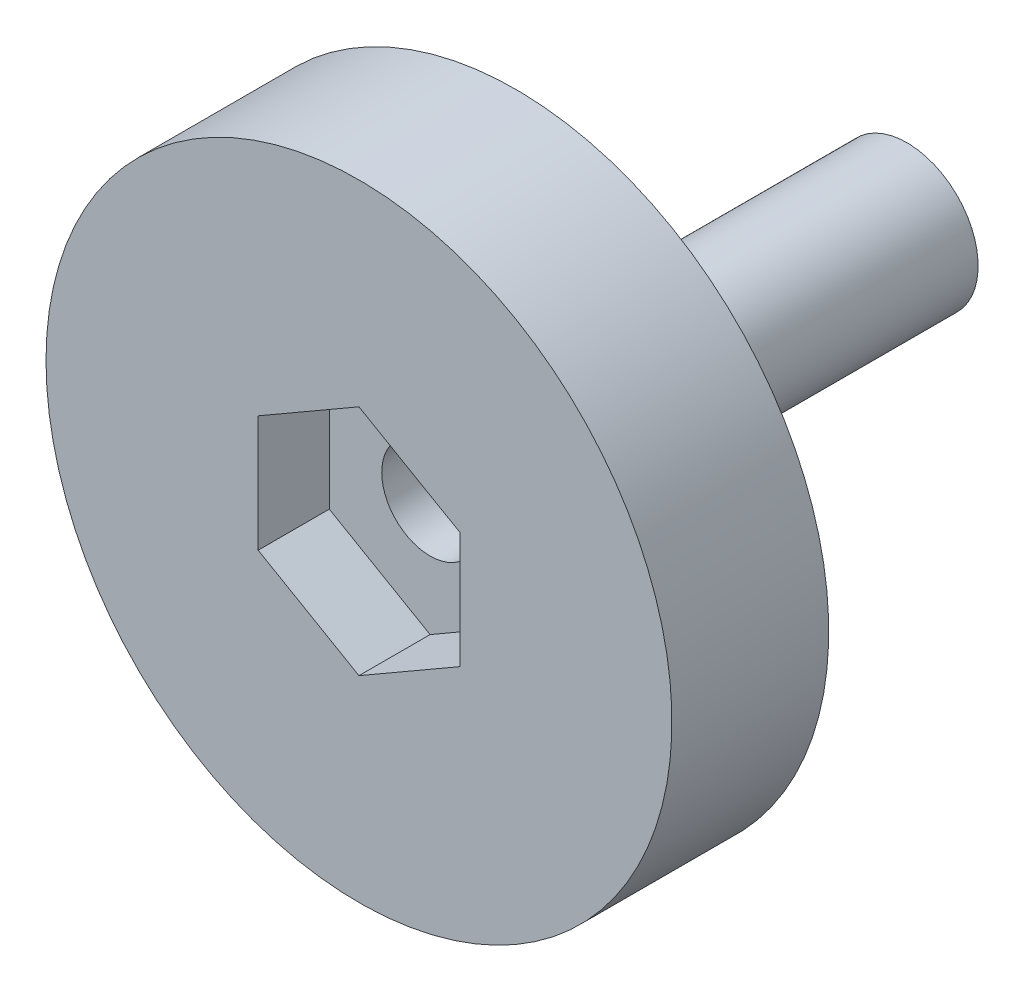
ISO-10303-21;
HEADER;
FILE_DESCRIPTION(('STEP AP214'),'2;1');
FILE_NAME('part.step','',(''),(''),'','','');
FILE_SCHEMA(('AUTOMOTIVE_DESIGN { 1 0 10303 214 1 1 1 1 }'));
ENDSEC;
DATA;
#1=APPLICATION_CONTEXT('core data for automotive mechanical design processes');
#2=APPLICATION_PROTOCOL_DEFINITION('international standard','automotive_design',2000,#1);
#3=PRODUCT_CONTEXT('',#1,'mechanical');
#4=PRODUCT('Part','Part','',(#3));
#5=PRODUCT_RELATED_PRODUCT_CATEGORY('part','',(#4));
#6=PRODUCT_DEFINITION_FORMATION('','',#4);
#7=PRODUCT_DEFINITION_CONTEXT('part definition',#1,'design');
#8=PRODUCT_DEFINITION('design','',#6,#7);
#9=PRODUCT_DEFINITION_SHAPE('','',#8);
#10=(LENGTH_UNIT() NAMED_UNIT(*) SI_UNIT(.MILLI.,.METRE.));
#11=(NAMED_UNIT(*) PLANE_ANGLE_UNIT() SI_UNIT($,.RADIAN.));
#12=(NAMED_UNIT(*) SI_UNIT($,.STERADIAN.) SOLID_ANGLE_UNIT());
#13=UNCERTAINTY_MEASURE_WITH_UNIT(LENGTH_MEASURE(1.E-05),#10,'distance_accuracy_value','');
#14=(GEOMETRIC_REPRESENTATION_CONTEXT(3) GLOBAL_UNCERTAINTY_ASSIGNED_CONTEXT((#13)) GLOBAL_UNIT_ASSIGNED_CONTEXT((#10,
#11,#12)) REPRESENTATION_CONTEXT('',''));
#15=CARTESIAN_POINT('',(0.,0.,0.));
#16=DIRECTION('',(0.,0.,1.));
#17=DIRECTION('',(1.,0.,0.));
#18=AXIS2_PLACEMENT_3D('',#15,#16,#17);
#19=CARTESIAN_POINT('',(-12.7762674554111,0.,-12.7000000000382));
#20=DIRECTION('',(0.,0.,-1.));
#21=DIRECTION('',(-1.,0.,0.));
#22=AXIS2_PLACEMENT_3D('',#19,#20,#21);
#23=CYLINDRICAL_SURFACE('',#22,2.15899999999996);
#24=CARTESIAN_POINT('',(-12.7762674554111,0.,-12.7000000000381));
#25=DIRECTION('',(0.,0.,-1.));
#26=DIRECTION('',(-1.,0.,0.));
#27=AXIS2_PLACEMENT_3D('',#24,#25,#26);
#28=CIRCLE('',#27,2.159);
#29=CARTESIAN_POINT('',(-14.9352674554111,0.,-12.7000000000381));
#30=VERTEX_POINT('',#29);
#31=EDGE_CURVE('E152',#30,#30,#28,.T.);
#32=ORIENTED_EDGE('',*,*,#31,.T.);
#33=EDGE_LOOP('',(#32));
#34=FACE_BOUND('',#33,.T.);
#35=CARTESIAN_POINT('',(-12.776267455411,0.,8.58749999999998));
#36=DIRECTION('',(0.,0.,1.));
#37=DIRECTION('',(1.,0.,0.));
#38=AXIS2_PLACEMENT_3D('',#35,#36,#37);
#39=CIRCLE('',#38,2.15899999999996);
#40=CARTESIAN_POINT('',(-10.6172674554111,0.,8.58749999999998));
#41=VERTEX_POINT('',#40);
#42=EDGE_CURVE('E42',#41,#41,#39,.F.);
#43=ORIENTED_EDGE('',*,*,#42,.F.);
#44=EDGE_LOOP('',(#43));
#45=FACE_BOUND('',#44,.T.);
#46=ADVANCED_FACE('F39',(#34,#45),#23,.F.);
#47=CARTESIAN_POINT('',(-10.6172674554111,0.,11.7625));
#48=DIRECTION('',(0.,0.,-1.));
#49=DIRECTION('',(-1.,0.,0.));
#50=AXIS2_PLACEMENT_3D('',#47,#48,#49);
#51=PLANE('',#50);
#52=DIRECTION('',(0.866025403784439,0.5,0.));
#53=VECTOR('',#52,1.);
#54=CARTESIAN_POINT('',(-12.776267455411,-5.19615242270663,11.7625));
#55=LINE('',#54,#53);
#56=CARTESIAN_POINT('',(-12.776267455411,-5.19615242270663,11.7625));
#57=VERTEX_POINT('',#56);
#58=CARTESIAN_POINT('',(-8.27626745541104,-2.59807621135332,11.7625));
#59=VERTEX_POINT('',#58);
#60=EDGE_CURVE('E134',#57,#59,#55,.T.);
#61=ORIENTED_EDGE('',*,*,#60,.F.);
#62=DIRECTION('',(0.866025403784439,-0.5,0.));
#63=VECTOR('',#62,1.);
#64=CARTESIAN_POINT('',(-17.276267455411,-2.59807621135332,11.7625));
#65=LINE('',#64,#63);
#66=CARTESIAN_POINT('',(-17.276267455411,-2.59807621135332,11.7625));
#67=VERTEX_POINT('',#66);
#68=EDGE_CURVE('E55',#67,#57,#65,.T.);
#69=ORIENTED_EDGE('',*,*,#68,.F.);
#70=DIRECTION('',(0.,-1.,0.));
#71=VECTOR('',#70,1.);
#72=CARTESIAN_POINT('',(-17.276267455411,2.59807621135332,11.7625));
#73=LINE('',#72,#71);
#74=CARTESIAN_POINT('',(-17.276267455411,2.59807621135332,11.7625));
#75=VERTEX_POINT('',#74);
#76=EDGE_CURVE('E143',#75,#67,#73,.T.);
#77=ORIENTED_EDGE('',*,*,#76,.F.);
#78=DIRECTION('',(-0.866025403784439,-0.5,0.));
#79=VECTOR('',#78,1.);
#80=CARTESIAN_POINT('',(-12.776267455411,5.19615242270663,11.7625));
#81=LINE('',#80,#79);
#82=CARTESIAN_POINT('',(-12.776267455411,5.19615242270663,11.7625));
#83=VERTEX_POINT('',#82);
#84=EDGE_CURVE('E141',#83,#75,#81,.T.);
#85=ORIENTED_EDGE('',*,*,#84,.F.);
#86=DIRECTION('',(-0.866025403784439,0.5,0.));
#87=VECTOR('',#86,1.);
#88=CARTESIAN_POINT('',(-8.27626745541104,2.59807621135331,11.7625));
#89=LINE('',#88,#87);
#90=CARTESIAN_POINT('',(-8.27626745541104,2.59807621135331,11.7625));
#91=VERTEX_POINT('',#90);
#92=EDGE_CURVE('E104',#91,#83,#89,.T.);
#93=ORIENTED_EDGE('',*,*,#92,.F.);
#94=DIRECTION('',(0.,1.,0.));
#95=VECTOR('',#94,1.);
#96=CARTESIAN_POINT('',(-8.27626745541104,-2.59807621135332,11.7625));
#97=LINE('',#96,#95);
#98=EDGE_CURVE('E137',#59,#91,#97,.T.);
#99=ORIENTED_EDGE('',*,*,#98,.F.);
#100=EDGE_LOOP('',(#61,#69,#77,#85,#93,#99));
#101=FACE_BOUND('',#100,.T.);
#102=CARTESIAN_POINT('',(-12.776267455411,0.,11.7625));
#103=DIRECTION('',(0.,0.,-1.));
#104=DIRECTION('',(-1.,0.,0.));
#105=AXIS2_PLACEMENT_3D('',#102,#103,#104);
#106=CIRCLE('',#105,13.9699999999999);
#107=CARTESIAN_POINT('',(-26.7462674554109,0.,11.7625000000001));
#108=VERTEX_POINT('',#107);
#109=EDGE_CURVE('E11',#108,#108,#106,.T.);
#110=ORIENTED_EDGE('',*,*,#109,.F.);
#111=EDGE_LOOP('',(#110));
#112=FACE_BOUND('',#111,.T.);
#113=ADVANCED_FACE('F179',(#101,#112),#51,.F.);
#114=CARTESIAN_POINT('',(-12.7762674554111,0.,-12.7000000000382));
#115=DIRECTION('',(0.,0.,-1.));
#116=DIRECTION('',(-1.,0.,0.));
#117=AXIS2_PLACEMENT_3D('',#114,#115,#116);
#118=CYLINDRICAL_SURFACE('',#117,13.9699999999999);
#119=CARTESIAN_POINT('',(-12.776267455411,0.,4.76250000000004));
#120=DIRECTION('',(0.,0.,-1.));
#121=DIRECTION('',(-1.,0.,0.));
#122=AXIS2_PLACEMENT_3D('',#119,#120,#121);
#123=CIRCLE('',#122,13.9699999999999);
#124=CARTESIAN_POINT('',(-26.746267455411,0.,4.76250000000009));
#125=VERTEX_POINT('',#124);
#126=EDGE_CURVE('E48',#125,#125,#123,.T.);
#127=ORIENTED_EDGE('',*,*,#126,.F.);
#128=EDGE_LOOP('',(#127));
#129=FACE_BOUND('',#128,.T.);
#130=ORIENTED_EDGE('',*,*,#109,.T.);
#131=EDGE_LOOP('',(#130));
#132=FACE_BOUND('',#131,.T.);
#133=ADVANCED_FACE('F176',(#129,#132),#118,.T.);
#134=CARTESIAN_POINT('',(-6.42626745541109,0.,4.76250000000001));
#135=DIRECTION('',(0.,0.,1.));
#136=DIRECTION('',(1.,0.,0.));
#137=AXIS2_PLACEMENT_3D('',#134,#135,#136);
#138=PLANE('',#137);
#139=CARTESIAN_POINT('',(-12.776267455411,0.,4.76250000000002));
#140=DIRECTION('',(0.,0.,-1.));
#141=DIRECTION('',(-1.,0.,0.));
#142=AXIS2_PLACEMENT_3D('',#139,#140,#141);
#143=CIRCLE('',#142,6.34999999999995);
#144=CARTESIAN_POINT('',(-19.126267455411,0.,4.76250000000004));
#145=VERTEX_POINT('',#144);
#146=EDGE_CURVE('E166',#145,#145,#143,.T.);
#147=ORIENTED_EDGE('',*,*,#146,.F.);
#148=EDGE_LOOP('',(#147));
#149=FACE_BOUND('',#148,.T.);
#150=ORIENTED_EDGE('',*,*,#126,.T.);
#151=EDGE_LOOP('',(#150));
#152=FACE_BOUND('',#151,.T.);
#153=ADVANCED_FACE('F174',(#149,#152),#138,.F.);
#154=CARTESIAN_POINT('',(-12.7762674554111,0.,-12.7000000000382));
#155=DIRECTION('',(0.,0.,-1.));
#156=DIRECTION('',(-1.,0.,0.));
#157=AXIS2_PLACEMENT_3D('',#154,#155,#156);
#158=CYLINDRICAL_SURFACE('',#157,6.34999999999995);
#159=CARTESIAN_POINT('',(-12.7762674554111,0.,0.));
#160=DIRECTION('',(0.,0.,-1.));
#161=DIRECTION('',(-1.,0.,0.));
#162=AXIS2_PLACEMENT_3D('',#159,#160,#161);
#163=CIRCLE('',#162,6.34999999999996);
#164=CARTESIAN_POINT('',(-19.126267455411,0.,0.));
#165=VERTEX_POINT('',#164);
#166=EDGE_CURVE('E162',#165,#165,#163,.T.);
#167=ORIENTED_EDGE('',*,*,#166,.F.);
#168=EDGE_LOOP('',(#167));
#169=FACE_BOUND('',#168,.T.);
#170=ORIENTED_EDGE('',*,*,#146,.T.);
#171=EDGE_LOOP('',(#170));
#172=FACE_BOUND('',#171,.T.);
#173=ADVANCED_FACE('F193',(#169,#172),#158,.T.);
#174=CARTESIAN_POINT('',(-9.6012674554111,0.,0.));
#175=DIRECTION('',(0.,0.,1.));
#176=DIRECTION('',(1.,0.,0.));
#177=AXIS2_PLACEMENT_3D('',#174,#175,#176);
#178=PLANE('',#177);
#179=CARTESIAN_POINT('',(-12.7762674554111,0.,0.));
#180=DIRECTION('',(0.,0.,-1.));
#181=DIRECTION('',(-1.,0.,0.));
#182=AXIS2_PLACEMENT_3D('',#179,#180,#181);
#183=CIRCLE('',#182,3.17499999999996);
#184=CARTESIAN_POINT('',(-15.951267455411,0.,0.));
#185=VERTEX_POINT('',#184);
#186=EDGE_CURVE('E158',#185,#185,#183,.T.);
#187=ORIENTED_EDGE('',*,*,#186,.F.);
#188=EDGE_LOOP('',(#187));
#189=FACE_BOUND('',#188,.T.);
#190=ORIENTED_EDGE('',*,*,#166,.T.);
#191=EDGE_LOOP('',(#190));
#192=FACE_BOUND('',#191,.T.);
#193=ADVANCED_FACE('F197',(#189,#192),#178,.F.);
#194=CARTESIAN_POINT('',(-12.7762674554111,0.,-12.7000000000382));
#195=DIRECTION('',(0.,0.,-1.));
#196=DIRECTION('',(-1.,0.,0.));
#197=AXIS2_PLACEMENT_3D('',#194,#195,#196);
#198=CYLINDRICAL_SURFACE('',#197,3.17499999999998);
#199=CARTESIAN_POINT('',(-12.7762674554111,0.,-12.7000000000381));
#200=DIRECTION('',(0.,0.,-1.));
#201=DIRECTION('',(-1.,0.,0.));
#202=AXIS2_PLACEMENT_3D('',#199,#200,#201);
#203=CIRCLE('',#202,3.175);
#204=CARTESIAN_POINT('',(-15.9512674554111,0.,-12.7000000000381));
#205=VERTEX_POINT('',#204);
#206=EDGE_CURVE('E155',#205,#205,#203,.T.);
#207=ORIENTED_EDGE('',*,*,#206,.F.);
#208=EDGE_LOOP('',(#207));
#209=FACE_BOUND('',#208,.T.);
#210=ORIENTED_EDGE('',*,*,#186,.T.);
#211=EDGE_LOOP('',(#210));
#212=FACE_BOUND('',#211,.T.);
#213=ADVANCED_FACE('F201',(#209,#212),#198,.T.);
#214=CARTESIAN_POINT('',(-10.6172674554111,0.,-12.7000000000382));
#215=DIRECTION('',(0.,0.,1.));
#216=DIRECTION('',(1.,0.,0.));
#217=AXIS2_PLACEMENT_3D('',#214,#215,#216);
#218=PLANE('',#217);
#219=ORIENTED_EDGE('',*,*,#31,.F.);
#220=EDGE_LOOP('',(#219));
#221=FACE_BOUND('',#220,.T.);
#222=ORIENTED_EDGE('',*,*,#206,.T.);
#223=EDGE_LOOP('',(#222));
#224=FACE_BOUND('',#223,.T.);
#225=ADVANCED_FACE('F205',(#221,#224),#218,.F.);
#226=CARTESIAN_POINT('',(0.,0.,8.58749999999998));
#227=DIRECTION('',(0.,0.,1.));
#228=DIRECTION('',(1.,0.,0.));
#229=AXIS2_PLACEMENT_3D('',#226,#227,#228);
#230=PLANE('',#229);
#231=DIRECTION('',(0.866025403784439,-0.5,0.));
#232=VECTOR('',#231,1.);
#233=CARTESIAN_POINT('',(-17.276267455411,-2.59807621135332,8.58749999999998));
#234=LINE('',#233,#232);
#235=CARTESIAN_POINT('',(-17.276267455411,-2.59807621135332,8.58749999999998));
#236=VERTEX_POINT('',#235);
#237=CARTESIAN_POINT('',(-12.776267455411,-5.19615242270663,8.58749999999998));
#238=VERTEX_POINT('',#237);
#239=EDGE_CURVE('E145',#236,#238,#234,.T.);
#240=ORIENTED_EDGE('',*,*,#239,.T.);
#241=DIRECTION('',(0.866025403784439,0.5,0.));
#242=VECTOR('',#241,1.);
#243=CARTESIAN_POINT('',(-12.776267455411,-5.19615242270663,8.58749999999998));
#244=LINE('',#243,#242);
#245=CARTESIAN_POINT('',(-8.27626745541104,-2.59807621135332,8.58749999999998));
#246=VERTEX_POINT('',#245);
#247=EDGE_CURVE('E128',#238,#246,#244,.T.);
#248=ORIENTED_EDGE('',*,*,#247,.T.);
#249=DIRECTION('',(0.,1.,0.));
#250=VECTOR('',#249,1.);
#251=CARTESIAN_POINT('',(-8.27626745541104,-2.59807621135332,8.58749999999998));
#252=LINE('',#251,#250);
#253=CARTESIAN_POINT('',(-8.27626745541104,2.59807621135331,8.58749999999998));
#254=VERTEX_POINT('',#253);
#255=EDGE_CURVE('E123',#246,#254,#252,.T.);
#256=ORIENTED_EDGE('',*,*,#255,.T.);
#257=DIRECTION('',(-0.866025403784439,0.5,0.));
#258=VECTOR('',#257,1.);
#259=CARTESIAN_POINT('',(-8.27626745541104,2.59807621135331,8.58749999999998));
#260=LINE('',#259,#258);
#261=CARTESIAN_POINT('',(-12.776267455411,5.19615242270663,8.58749999999998));
#262=VERTEX_POINT('',#261);
#263=EDGE_CURVE('E101',#254,#262,#260,.T.);
#264=ORIENTED_EDGE('',*,*,#263,.T.);
#265=DIRECTION('',(-0.866025403784439,-0.5,0.));
#266=VECTOR('',#265,1.);
#267=CARTESIAN_POINT('',(-12.776267455411,5.19615242270663,8.58749999999998));
#268=LINE('',#267,#266);
#269=CARTESIAN_POINT('',(-17.276267455411,2.59807621135332,8.58749999999998));
#270=VERTEX_POINT('',#269);
#271=EDGE_CURVE('E112',#262,#270,#268,.T.);
#272=ORIENTED_EDGE('',*,*,#271,.T.);
#273=DIRECTION('',(0.,-1.,0.));
#274=VECTOR('',#273,1.);
#275=CARTESIAN_POINT('',(-17.276267455411,2.59807621135332,8.58749999999998));
#276=LINE('',#275,#274);
#277=EDGE_CURVE('E116',#270,#236,#276,.T.);
#278=ORIENTED_EDGE('',*,*,#277,.T.);
#279=EDGE_LOOP('',(#240,#248,#256,#264,#272,#278));
#280=FACE_BOUND('',#279,.T.);
#281=ORIENTED_EDGE('',*,*,#42,.T.);
#282=EDGE_LOOP('',(#281));
#283=FACE_BOUND('',#282,.T.);
#284=ADVANCED_FACE('F119',(#280,#283),#230,.T.);
#285=CARTESIAN_POINT('',(-17.276267455411,-2.59807621135332,8.58749999999998));
#286=DIRECTION('',(-0.5,-0.866025403784439,0.));
#287=DIRECTION('',(0.866025403784439,-0.5,0.));
#288=AXIS2_PLACEMENT_3D('',#285,#286,#287);
#289=PLANE('',#288);
#290=ORIENTED_EDGE('',*,*,#68,.T.);
#291=DIRECTION('',(0.,0.,1.));
#292=VECTOR('',#291,1.);
#293=CARTESIAN_POINT('',(-12.776267455411,-5.19615242270663,8.58749999999998));
#294=LINE('',#293,#292);
#295=EDGE_CURVE('E85',#238,#57,#294,.T.);
#296=ORIENTED_EDGE('',*,*,#295,.F.);
#297=ORIENTED_EDGE('',*,*,#239,.F.);
#298=DIRECTION('',(0.,0.,1.));
#299=VECTOR('',#298,1.);
#300=CARTESIAN_POINT('',(-17.276267455411,-2.59807621135332,8.58749999999998));
#301=LINE('',#300,#299);
#302=EDGE_CURVE('E63',#236,#67,#301,.T.);
#303=ORIENTED_EDGE('',*,*,#302,.T.);
#304=EDGE_LOOP('',(#290,#296,#297,#303));
#305=FACE_BOUND('',#304,.T.);
#306=ADVANCED_FACE('F210',(#305),#289,.F.);
#307=CARTESIAN_POINT('',(-17.276267455411,2.59807621135332,8.58749999999998));
#308=DIRECTION('',(-1.,0.,0.));
#309=DIRECTION('',(0.,0.,1.));
#310=AXIS2_PLACEMENT_3D('',#307,#308,#309);
#311=PLANE('',#310);
#312=ORIENTED_EDGE('',*,*,#76,.T.);
#313=ORIENTED_EDGE('',*,*,#302,.F.);
#314=ORIENTED_EDGE('',*,*,#277,.F.);
#315=DIRECTION('',(0.,0.,1.));
#316=VECTOR('',#315,1.);
#317=CARTESIAN_POINT('',(-17.276267455411,2.59807621135332,8.58749999999998));
#318=LINE('',#317,#316);
#319=EDGE_CURVE('E108',#270,#75,#318,.T.);
#320=ORIENTED_EDGE('',*,*,#319,.T.);
#321=EDGE_LOOP('',(#312,#313,#314,#320));
#322=FACE_BOUND('',#321,.T.);
#323=ADVANCED_FACE('F213',(#322),#311,.F.);
#324=CARTESIAN_POINT('',(-12.776267455411,5.19615242270663,8.58749999999998));
#325=DIRECTION('',(-0.5,0.866025403784439,0.));
#326=DIRECTION('',(-0.866025403784439,-0.5,0.));
#327=AXIS2_PLACEMENT_3D('',#324,#325,#326);
#328=PLANE('',#327);
#329=ORIENTED_EDGE('',*,*,#84,.T.);
#330=ORIENTED_EDGE('',*,*,#319,.F.);
#331=ORIENTED_EDGE('',*,*,#271,.F.);
#332=DIRECTION('',(0.,0.,1.));
#333=VECTOR('',#332,1.);
#334=CARTESIAN_POINT('',(-12.776267455411,5.19615242270663,8.58749999999998));
#335=LINE('',#334,#333);
#336=EDGE_CURVE('E97',#262,#83,#335,.T.);
#337=ORIENTED_EDGE('',*,*,#336,.T.);
#338=EDGE_LOOP('',(#329,#330,#331,#337));
#339=FACE_BOUND('',#338,.T.);
#340=ADVANCED_FACE('F113',(#339),#328,.F.);
#341=CARTESIAN_POINT('',(-8.27626745541104,2.59807621135331,8.58749999999998));
#342=DIRECTION('',(0.5,0.866025403784439,0.));
#343=DIRECTION('',(-0.866025403784439,0.5,0.));
#344=AXIS2_PLACEMENT_3D('',#341,#342,#343);
#345=PLANE('',#344);
#346=ORIENTED_EDGE('',*,*,#92,.T.);
#347=ORIENTED_EDGE('',*,*,#336,.F.);
#348=ORIENTED_EDGE('',*,*,#263,.F.);
#349=DIRECTION('',(0.,0.,1.));
#350=VECTOR('',#349,1.);
#351=CARTESIAN_POINT('',(-8.27626745541104,2.59807621135331,8.58749999999998));
#352=LINE('',#351,#350);
#353=EDGE_CURVE('E109',#254,#91,#352,.T.);
#354=ORIENTED_EDGE('',*,*,#353,.T.);
#355=EDGE_LOOP('',(#346,#347,#348,#354));
#356=FACE_BOUND('',#355,.T.);
#357=ADVANCED_FACE('F99',(#356),#345,.F.);
#358=CARTESIAN_POINT('',(-8.27626745541104,-2.59807621135332,8.58749999999998));
#359=DIRECTION('',(1.,0.,0.));
#360=DIRECTION('',(0.,1.,0.));
#361=AXIS2_PLACEMENT_3D('',#358,#359,#360);
#362=PLANE('',#361);
#363=ORIENTED_EDGE('',*,*,#98,.T.);
#364=ORIENTED_EDGE('',*,*,#353,.F.);
#365=ORIENTED_EDGE('',*,*,#255,.F.);
#366=DIRECTION('',(0.,0.,1.));
#367=VECTOR('',#366,1.);
#368=CARTESIAN_POINT('',(-8.27626745541104,-2.59807621135332,8.58749999999998));
#369=LINE('',#368,#367);
#370=EDGE_CURVE('E149',#246,#59,#369,.T.);
#371=ORIENTED_EDGE('',*,*,#370,.T.);
#372=EDGE_LOOP('',(#363,#364,#365,#371));
#373=FACE_BOUND('',#372,.T.);
#374=ADVANCED_FACE('F217',(#373),#362,.F.);
#375=CARTESIAN_POINT('',(-12.776267455411,-5.19615242270663,8.58749999999998));
#376=DIRECTION('',(0.5,-0.866025403784439,0.));
#377=DIRECTION('',(0.866025403784439,0.5,0.));
#378=AXIS2_PLACEMENT_3D('',#375,#376,#377);
#379=PLANE('',#378);
#380=ORIENTED_EDGE('',*,*,#60,.T.);
#381=ORIENTED_EDGE('',*,*,#370,.F.);
#382=ORIENTED_EDGE('',*,*,#247,.F.);
#383=ORIENTED_EDGE('',*,*,#295,.T.);
#384=EDGE_LOOP('',(#380,#381,#382,#383));
#385=FACE_BOUND('',#384,.T.);
#386=ADVANCED_FACE('F214',(#385),#379,.F.);
#387=CLOSED_SHELL('',(#46,#113,#133,#153,#173,#193,#213,#225,#284,#306,#323,#340,#357,#374,#386));
#388=MANIFOLD_SOLID_BREP('B2',#387);
#389=ADVANCED_BREP_SHAPE_REPRESENTATION('',(#18,#388),#14);
#390=SHAPE_DEFINITION_REPRESENTATION(#9,#389);
ENDSEC;
END-ISO-10303-21;
